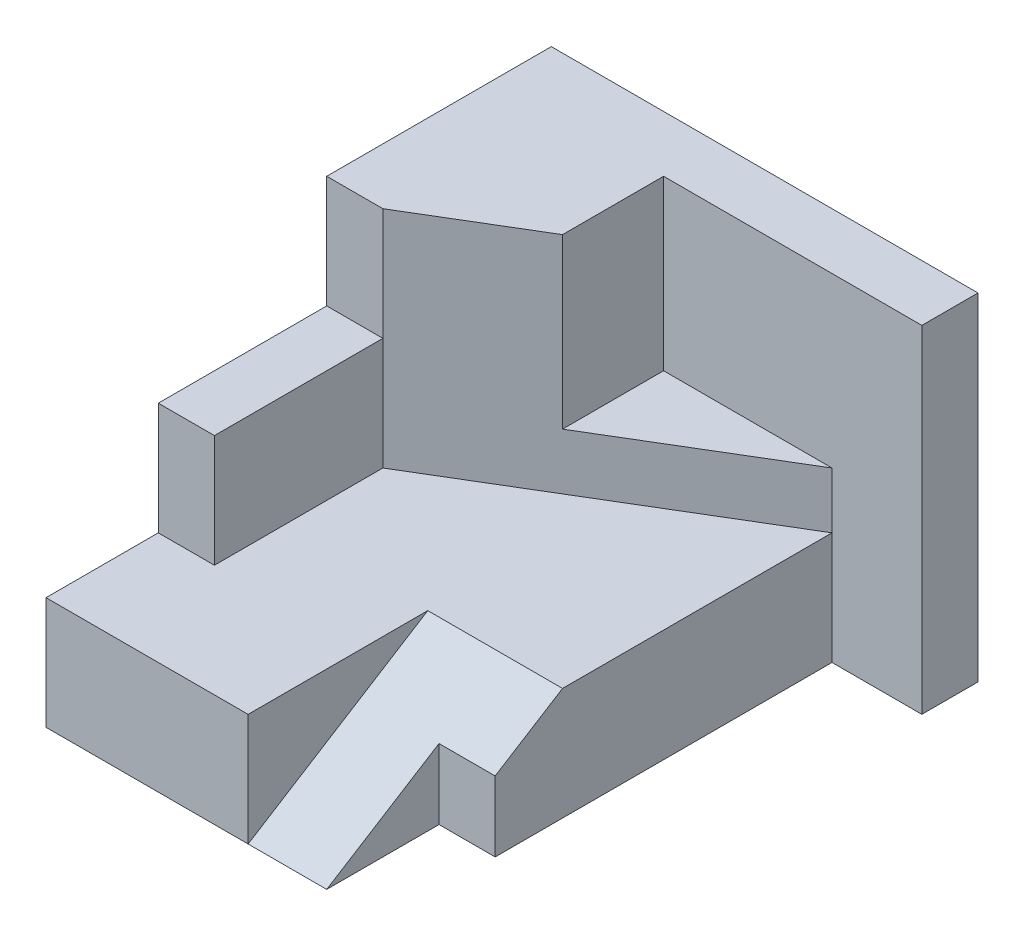
ISO-10303-21;
HEADER;
FILE_DESCRIPTION(('STEP AP214'),'2;1');
FILE_NAME('part.step','',(''),(''),'','','');
FILE_SCHEMA(('AUTOMOTIVE_DESIGN { 1 0 10303 214 1 1 1 1 }'));
ENDSEC;
DATA;
#1=APPLICATION_CONTEXT('core data for automotive mechanical design processes');
#2=APPLICATION_PROTOCOL_DEFINITION('international standard','automotive_design',2000,#1);
#3=PRODUCT_CONTEXT('',#1,'mechanical');
#4=PRODUCT('Part','Part','',(#3));
#5=PRODUCT_RELATED_PRODUCT_CATEGORY('part','',(#4));
#6=PRODUCT_DEFINITION_FORMATION('','',#4);
#7=PRODUCT_DEFINITION_CONTEXT('part definition',#1,'design');
#8=PRODUCT_DEFINITION('design','',#6,#7);
#9=PRODUCT_DEFINITION_SHAPE('','',#8);
#10=(LENGTH_UNIT() NAMED_UNIT(*) SI_UNIT(.MILLI.,.METRE.));
#11=(NAMED_UNIT(*) PLANE_ANGLE_UNIT() SI_UNIT($,.RADIAN.));
#12=(NAMED_UNIT(*) SI_UNIT($,.STERADIAN.) SOLID_ANGLE_UNIT());
#13=UNCERTAINTY_MEASURE_WITH_UNIT(LENGTH_MEASURE(1.E-05),#10,'distance_accuracy_value','');
#14=(GEOMETRIC_REPRESENTATION_CONTEXT(3) GLOBAL_UNCERTAINTY_ASSIGNED_CONTEXT((#13)) GLOBAL_UNIT_ASSIGNED_CONTEXT((#10,
#11,#12)) REPRESENTATION_CONTEXT('',''));
#15=CARTESIAN_POINT('',(0.,0.,0.));
#16=DIRECTION('',(0.,0.,1.));
#17=DIRECTION('',(1.,0.,0.));
#18=AXIS2_PLACEMENT_3D('',#15,#16,#17);
#19=CARTESIAN_POINT('',(0.,0.,0.));
#20=DIRECTION('',(0.,-1.,0.));
#21=DIRECTION('',(0.,0.,-1.));
#22=AXIS2_PLACEMENT_3D('',#19,#20,#21);
#23=PLANE('',#22);
#24=DIRECTION('',(0.,0.,-1.));
#25=VECTOR('',#24,1.);
#26=CARTESIAN_POINT('',(30.,0.,0.));
#27=LINE('',#26,#25);
#28=CARTESIAN_POINT('',(30.,0.,35.));
#29=VERTEX_POINT('',#28);
#30=CARTESIAN_POINT('',(30.,0.,5.));
#31=VERTEX_POINT('',#30);
#32=EDGE_CURVE('E170',#29,#31,#27,.T.);
#33=ORIENTED_EDGE('',*,*,#32,.F.);
#34=DIRECTION('',(-1.,0.,0.));
#35=VECTOR('',#34,1.);
#36=CARTESIAN_POINT('',(30.,0.,35.));
#37=LINE('',#36,#35);
#38=CARTESIAN_POINT('',(25.,0.,35.));
#39=VERTEX_POINT('',#38);
#40=EDGE_CURVE('E155',#29,#39,#37,.T.);
#41=ORIENTED_EDGE('',*,*,#40,.T.);
#42=DIRECTION('',(0.,0.,1.));
#43=VECTOR('',#42,1.);
#44=CARTESIAN_POINT('',(25.,0.,45.));
#45=LINE('',#44,#43);
#46=CARTESIAN_POINT('',(25.,0.,45.));
#47=VERTEX_POINT('',#46);
#48=EDGE_CURVE('E164',#39,#47,#45,.T.);
#49=ORIENTED_EDGE('',*,*,#48,.T.);
#50=DIRECTION('',(1.,0.,0.));
#51=VECTOR('',#50,1.);
#52=CARTESIAN_POINT('',(18.,0.,45.));
#53=LINE('',#52,#51);
#54=CARTESIAN_POINT('',(18.,0.,45.));
#55=VERTEX_POINT('',#54);
#56=EDGE_CURVE('E264',#55,#47,#53,.T.);
#57=ORIENTED_EDGE('',*,*,#56,.F.);
#58=DIRECTION('',(1.,0.,0.));
#59=VECTOR('',#58,1.);
#60=CARTESIAN_POINT('',(0.,0.,45.));
#61=LINE('',#60,#59);
#62=CARTESIAN_POINT('',(0.,0.,45.));
#63=VERTEX_POINT('',#62);
#64=EDGE_CURVE('E181',#63,#55,#61,.T.);
#65=ORIENTED_EDGE('',*,*,#64,.F.);
#66=DIRECTION('',(0.,0.,1.));
#67=VECTOR('',#66,1.);
#68=CARTESIAN_POINT('',(0.,0.,20.));
#69=LINE('',#68,#67);
#70=CARTESIAN_POINT('',(0.,0.,0.));
#71=VERTEX_POINT('',#70);
#72=EDGE_CURVE('E204',#71,#63,#69,.T.);
#73=ORIENTED_EDGE('',*,*,#72,.F.);
#74=DIRECTION('',(-1.,0.,0.));
#75=VECTOR('',#74,1.);
#76=CARTESIAN_POINT('',(0.,0.,0.));
#77=LINE('',#76,#75);
#78=CARTESIAN_POINT('',(38.,0.,0.));
#79=VERTEX_POINT('',#78);
#80=EDGE_CURVE('E210',#79,#71,#77,.T.);
#81=ORIENTED_EDGE('',*,*,#80,.F.);
#82=DIRECTION('',(0.,0.,-1.));
#83=VECTOR('',#82,1.);
#84=CARTESIAN_POINT('',(38.,0.,0.));
#85=LINE('',#84,#83);
#86=CARTESIAN_POINT('',(38.,0.,5.));
#87=VERTEX_POINT('',#86);
#88=EDGE_CURVE('E231',#87,#79,#85,.T.);
#89=ORIENTED_EDGE('',*,*,#88,.F.);
#90=DIRECTION('',(1.,0.,0.));
#91=VECTOR('',#90,1.);
#92=CARTESIAN_POINT('',(38.,0.,5.));
#93=LINE('',#92,#91);
#94=EDGE_CURVE('E178',#31,#87,#93,.T.);
#95=ORIENTED_EDGE('',*,*,#94,.F.);
#96=EDGE_LOOP('',(#33,#41,#49,#57,#65,#73,#81,#89,#95));
#97=FACE_BOUND('',#96,.T.);
#98=ADVANCED_FACE('F39',(#97),#23,.T.);
#99=CARTESIAN_POINT('',(30.,10.,0.));
#100=DIRECTION('',(-1.,0.,0.));
#101=DIRECTION('',(0.,0.,1.));
#102=AXIS2_PLACEMENT_3D('',#99,#100,#101);
#103=PLANE('',#102);
#104=DIRECTION('',(0.,-1.,0.));
#105=VECTOR('',#104,1.);
#106=CARTESIAN_POINT('',(30.,30.,35.));
#107=LINE('',#106,#105);
#108=CARTESIAN_POINT('',(30.,6.25,35.));
#109=VERTEX_POINT('',#108);
#110=EDGE_CURVE('E158',#109,#29,#107,.T.);
#111=ORIENTED_EDGE('',*,*,#110,.T.);
#112=ORIENTED_EDGE('',*,*,#32,.T.);
#113=DIRECTION('',(0.,1.,0.));
#114=VECTOR('',#113,1.);
#115=CARTESIAN_POINT('',(30.,30.,5.));
#116=LINE('',#115,#114);
#117=CARTESIAN_POINT('',(30.,10.,5.));
#118=VERTEX_POINT('',#117);
#119=EDGE_CURVE('E196',#31,#118,#116,.T.);
#120=ORIENTED_EDGE('',*,*,#119,.T.);
#121=DIRECTION('',(0.,0.,-1.));
#122=VECTOR('',#121,1.);
#123=CARTESIAN_POINT('',(30.,10.,0.));
#124=LINE('',#123,#122);
#125=CARTESIAN_POINT('',(30.,10.,29.));
#126=VERTEX_POINT('',#125);
#127=EDGE_CURVE('E197',#126,#118,#124,.T.);
#128=ORIENTED_EDGE('',*,*,#127,.F.);
#129=DIRECTION('',(0.,0.52999894000318,-0.847998304005088));
#130=VECTOR('',#129,1.);
#131=CARTESIAN_POINT('',(30.,0.,45.));
#132=LINE('',#131,#130);
#133=EDGE_CURVE('E173',#109,#126,#132,.T.);
#134=ORIENTED_EDGE('',*,*,#133,.F.);
#135=EDGE_LOOP('',(#111,#112,#120,#128,#134));
#136=FACE_BOUND('',#135,.T.);
#137=ADVANCED_FACE('F168',(#136),#103,.F.);
#138=CARTESIAN_POINT('',(18.,0.,45.));
#139=DIRECTION('',(0.,-0.847998304005088,-0.52999894000318));
#140=DIRECTION('',(0.,0.52999894000318,-0.847998304005088));
#141=AXIS2_PLACEMENT_3D('',#138,#139,#140);
#142=PLANE('',#141);
#143=DIRECTION('',(-1.,0.,0.));
#144=VECTOR('',#143,1.);
#145=CARTESIAN_POINT('',(18.,6.25,35.));
#146=LINE('',#145,#144);
#147=CARTESIAN_POINT('',(25.,6.25,35.));
#148=VERTEX_POINT('',#147);
#149=EDGE_CURVE('E11',#109,#148,#146,.T.);
#150=ORIENTED_EDGE('',*,*,#149,.F.);
#151=ORIENTED_EDGE('',*,*,#133,.T.);
#152=DIRECTION('',(1.,0.,0.));
#153=VECTOR('',#152,1.);
#154=CARTESIAN_POINT('',(18.,10.,29.));
#155=LINE('',#154,#153);
#156=CARTESIAN_POINT('',(18.,10.,29.));
#157=VERTEX_POINT('',#156);
#158=EDGE_CURVE('E271',#157,#126,#155,.T.);
#159=ORIENTED_EDGE('',*,*,#158,.F.);
#160=DIRECTION('',(0.,0.52999894000318,-0.847998304005088));
#161=VECTOR('',#160,1.);
#162=CARTESIAN_POINT('',(18.,0.,45.));
#163=LINE('',#162,#161);
#164=EDGE_CURVE('E269',#55,#157,#163,.T.);
#165=ORIENTED_EDGE('',*,*,#164,.F.);
#166=ORIENTED_EDGE('',*,*,#56,.T.);
#167=DIRECTION('',(0.,-0.52999894000318,0.847998304005088));
#168=VECTOR('',#167,1.);
#169=CARTESIAN_POINT('',(25.,0.,45.));
#170=LINE('',#169,#168);
#171=EDGE_CURVE('E48',#148,#47,#170,.T.);
#172=ORIENTED_EDGE('',*,*,#171,.F.);
#173=EDGE_LOOP('',(#150,#151,#159,#165,#166,#172));
#174=FACE_BOUND('',#173,.T.);
#175=ADVANCED_FACE('F268',(#174),#142,.F.);
#176=CARTESIAN_POINT('',(0.,10.,45.));
#177=DIRECTION('',(0.,0.,-1.));
#178=DIRECTION('',(-1.,0.,0.));
#179=AXIS2_PLACEMENT_3D('',#176,#177,#178);
#180=PLANE('',#179);
#181=DIRECTION('',(0.,-1.,0.));
#182=VECTOR('',#181,1.);
#183=CARTESIAN_POINT('',(18.,10.,45.));
#184=LINE('',#183,#182);
#185=CARTESIAN_POINT('',(18.,10.,45.));
#186=VERTEX_POINT('',#185);
#187=EDGE_CURVE('E278',#186,#55,#184,.T.);
#188=ORIENTED_EDGE('',*,*,#187,.F.);
#189=DIRECTION('',(1.,0.,0.));
#190=VECTOR('',#189,1.);
#191=CARTESIAN_POINT('',(0.,10.,45.));
#192=LINE('',#191,#190);
#193=CARTESIAN_POINT('',(0.,10.,45.));
#194=VERTEX_POINT('',#193);
#195=EDGE_CURVE('E185',#194,#186,#192,.T.);
#196=ORIENTED_EDGE('',*,*,#195,.F.);
#197=DIRECTION('',(0.,-1.,0.));
#198=VECTOR('',#197,1.);
#199=CARTESIAN_POINT('',(0.,10.,45.));
#200=LINE('',#199,#198);
#201=EDGE_CURVE('E192',#194,#63,#200,.T.);
#202=ORIENTED_EDGE('',*,*,#201,.T.);
#203=ORIENTED_EDGE('',*,*,#64,.T.);
#204=EDGE_LOOP('',(#188,#196,#202,#203));
#205=FACE_BOUND('',#204,.T.);
#206=ADVANCED_FACE('F367',(#205),#180,.F.);
#207=CARTESIAN_POINT('',(5.,30.,20.));
#208=DIRECTION('',(0.,0.,-1.));
#209=DIRECTION('',(-1.,0.,0.));
#210=AXIS2_PLACEMENT_3D('',#207,#208,#209);
#211=PLANE('',#210);
#212=DIRECTION('',(-1.,0.,0.));
#213=VECTOR('',#212,1.);
#214=CARTESIAN_POINT('',(5.,20.,20.));
#215=LINE('',#214,#213);
#216=CARTESIAN_POINT('',(5.,20.,20.));
#217=VERTEX_POINT('',#216);
#218=CARTESIAN_POINT('',(0.,20.,20.));
#219=VERTEX_POINT('',#218);
#220=EDGE_CURVE('E188',#217,#219,#215,.T.);
#221=ORIENTED_EDGE('',*,*,#220,.F.);
#222=DIRECTION('',(0.,-1.,0.));
#223=VECTOR('',#222,1.);
#224=CARTESIAN_POINT('',(5.,30.,20.));
#225=LINE('',#224,#223);
#226=CARTESIAN_POINT('',(5.,30.,20.));
#227=VERTEX_POINT('',#226);
#228=EDGE_CURVE('E251',#227,#217,#225,.T.);
#229=ORIENTED_EDGE('',*,*,#228,.F.);
#230=DIRECTION('',(1.,0.,0.));
#231=VECTOR('',#230,1.);
#232=CARTESIAN_POINT('',(5.,30.,20.));
#233=LINE('',#232,#231);
#234=CARTESIAN_POINT('',(0.,30.,20.));
#235=VERTEX_POINT('',#234);
#236=EDGE_CURVE('E209',#235,#227,#233,.T.);
#237=ORIENTED_EDGE('',*,*,#236,.F.);
#238=DIRECTION('',(0.,-1.,0.));
#239=VECTOR('',#238,1.);
#240=CARTESIAN_POINT('',(0.,30.,20.));
#241=LINE('',#240,#239);
#242=EDGE_CURVE('E255',#235,#219,#241,.T.);
#243=ORIENTED_EDGE('',*,*,#242,.T.);
#244=EDGE_LOOP('',(#221,#229,#237,#243));
#245=FACE_BOUND('',#244,.T.);
#246=ADVANCED_FACE('F409',(#245),#211,.F.);
#247=CARTESIAN_POINT('',(0.,10.,0.));
#248=DIRECTION('',(0.,1.,0.));
#249=DIRECTION('',(0.,0.,1.));
#250=AXIS2_PLACEMENT_3D('',#247,#248,#249);
#251=PLANE('',#250);
#252=ORIENTED_EDGE('',*,*,#158,.T.);
#253=ORIENTED_EDGE('',*,*,#127,.T.);
#254=DIRECTION('',(0.857492925712544,0.,-0.514495755427526));
#255=VECTOR('',#254,1.);
#256=CARTESIAN_POINT('',(30.,10.,5.));
#257=LINE('',#256,#255);
#258=CARTESIAN_POINT('',(5.,10.,20.));
#259=VERTEX_POINT('',#258);
#260=EDGE_CURVE('E200',#259,#118,#257,.T.);
#261=ORIENTED_EDGE('',*,*,#260,.F.);
#262=DIRECTION('',(0.,0.,-1.));
#263=VECTOR('',#262,1.);
#264=CARTESIAN_POINT('',(5.,10.,20.));
#265=LINE('',#264,#263);
#266=CARTESIAN_POINT('',(5.,10.,35.));
#267=VERTEX_POINT('',#266);
#268=EDGE_CURVE('E317',#267,#259,#265,.T.);
#269=ORIENTED_EDGE('',*,*,#268,.F.);
#270=DIRECTION('',(-1.,0.,0.));
#271=VECTOR('',#270,1.);
#272=CARTESIAN_POINT('',(5.,10.,35.));
#273=LINE('',#272,#271);
#274=CARTESIAN_POINT('',(0.,10.,35.));
#275=VERTEX_POINT('',#274);
#276=EDGE_CURVE('E321',#267,#275,#273,.T.);
#277=ORIENTED_EDGE('',*,*,#276,.T.);
#278=DIRECTION('',(0.,0.,1.));
#279=VECTOR('',#278,1.);
#280=CARTESIAN_POINT('',(0.,10.,0.));
#281=LINE('',#280,#279);
#282=EDGE_CURVE('E180',#275,#194,#281,.T.);
#283=ORIENTED_EDGE('',*,*,#282,.T.);
#284=ORIENTED_EDGE('',*,*,#195,.T.);
#285=DIRECTION('',(0.,0.,1.));
#286=VECTOR('',#285,1.);
#287=CARTESIAN_POINT('',(18.,10.,29.));
#288=LINE('',#287,#286);
#289=EDGE_CURVE('E62',#157,#186,#288,.T.);
#290=ORIENTED_EDGE('',*,*,#289,.F.);
#291=EDGE_LOOP('',(#252,#253,#261,#269,#277,#283,#284,#290));
#292=FACE_BOUND('',#291,.T.);
#293=ADVANCED_FACE('F342',(#292),#251,.T.);
#294=CARTESIAN_POINT('',(0.,30.,20.));
#295=DIRECTION('',(1.,0.,0.));
#296=DIRECTION('',(0.,0.,-1.));
#297=AXIS2_PLACEMENT_3D('',#294,#295,#296);
#298=PLANE('',#297);
#299=DIRECTION('',(0.,0.,1.));
#300=VECTOR('',#299,1.);
#301=CARTESIAN_POINT('',(0.,20.,20.));
#302=LINE('',#301,#300);
#303=CARTESIAN_POINT('',(0.,20.,35.));
#304=VERTEX_POINT('',#303);
#305=EDGE_CURVE('E301',#219,#304,#302,.T.);
#306=ORIENTED_EDGE('',*,*,#305,.F.);
#307=ORIENTED_EDGE('',*,*,#242,.F.);
#308=DIRECTION('',(0.,0.,1.));
#309=VECTOR('',#308,1.);
#310=CARTESIAN_POINT('',(0.,30.,20.));
#311=LINE('',#310,#309);
#312=CARTESIAN_POINT('',(0.,30.,0.));
#313=VERTEX_POINT('',#312);
#314=EDGE_CURVE('E205',#313,#235,#311,.T.);
#315=ORIENTED_EDGE('',*,*,#314,.F.);
#316=DIRECTION('',(0.,-1.,0.));
#317=VECTOR('',#316,1.);
#318=CARTESIAN_POINT('',(0.,30.,0.));
#319=LINE('',#318,#317);
#320=EDGE_CURVE('E226',#313,#71,#319,.T.);
#321=ORIENTED_EDGE('',*,*,#320,.T.);
#322=ORIENTED_EDGE('',*,*,#72,.T.);
#323=ORIENTED_EDGE('',*,*,#201,.F.);
#324=ORIENTED_EDGE('',*,*,#282,.F.);
#325=DIRECTION('',(0.,-1.,0.));
#326=VECTOR('',#325,1.);
#327=CARTESIAN_POINT('',(0.,10.,35.));
#328=LINE('',#327,#326);
#329=EDGE_CURVE('E310',#304,#275,#328,.T.);
#330=ORIENTED_EDGE('',*,*,#329,.F.);
#331=EDGE_LOOP('',(#306,#307,#315,#321,#322,#323,#324,#330));
#332=FACE_BOUND('',#331,.T.);
#333=ADVANCED_FACE('F41',(#332),#298,.F.);
#334=CARTESIAN_POINT('',(30.,30.,5.));
#335=DIRECTION('',(-0.514495755427526,0.,-0.857492925712544));
#336=DIRECTION('',(-0.857492925712544,0.,0.514495755427526));
#337=AXIS2_PLACEMENT_3D('',#334,#335,#336);
#338=PLANE('',#337);
#339=DIRECTION('',(0.857492925712544,0.,-0.514495755427527));
#340=VECTOR('',#339,1.);
#341=CARTESIAN_POINT('',(15.,15.,14.));
#342=LINE('',#341,#340);
#343=CARTESIAN_POINT('',(15.,15.,14.));
#344=VERTEX_POINT('',#343);
#345=CARTESIAN_POINT('',(30.,15.,5.));
#346=VERTEX_POINT('',#345);
#347=EDGE_CURVE('E282',#344,#346,#342,.T.);
#348=ORIENTED_EDGE('',*,*,#347,.F.);
#349=DIRECTION('',(0.,1.,0.));
#350=VECTOR('',#349,1.);
#351=CARTESIAN_POINT('',(15.,15.,14.));
#352=LINE('',#351,#350);
#353=CARTESIAN_POINT('',(15.,30.,14.));
#354=VERTEX_POINT('',#353);
#355=EDGE_CURVE('E297',#344,#354,#352,.T.);
#356=ORIENTED_EDGE('',*,*,#355,.T.);
#357=DIRECTION('',(0.857492925712544,0.,-0.514495755427526));
#358=VECTOR('',#357,1.);
#359=CARTESIAN_POINT('',(30.,30.,5.));
#360=LINE('',#359,#358);
#361=EDGE_CURVE('E213',#227,#354,#360,.T.);
#362=ORIENTED_EDGE('',*,*,#361,.F.);
#363=ORIENTED_EDGE('',*,*,#228,.T.);
#364=DIRECTION('',(0.,1.,0.));
#365=VECTOR('',#364,1.);
#366=CARTESIAN_POINT('',(5.,10.,20.));
#367=LINE('',#366,#365);
#368=EDGE_CURVE('E305',#259,#217,#367,.T.);
#369=ORIENTED_EDGE('',*,*,#368,.F.);
#370=ORIENTED_EDGE('',*,*,#260,.T.);
#371=DIRECTION('',(0.,-1.,0.));
#372=VECTOR('',#371,1.);
#373=CARTESIAN_POINT('',(30.,30.,5.));
#374=LINE('',#373,#372);
#375=EDGE_CURVE('E247',#346,#118,#374,.T.);
#376=ORIENTED_EDGE('',*,*,#375,.F.);
#377=EDGE_LOOP('',(#348,#356,#362,#363,#369,#370,#376));
#378=FACE_BOUND('',#377,.T.);
#379=ADVANCED_FACE('F348',(#378),#338,.F.);
#380=CARTESIAN_POINT('',(38.,30.,5.));
#381=DIRECTION('',(0.,0.,-1.));
#382=DIRECTION('',(-1.,0.,0.));
#383=AXIS2_PLACEMENT_3D('',#380,#381,#382);
#384=PLANE('',#383);
#385=ORIENTED_EDGE('',*,*,#94,.T.);
#386=DIRECTION('',(0.,-1.,0.));
#387=VECTOR('',#386,1.);
#388=CARTESIAN_POINT('',(38.,30.,5.));
#389=LINE('',#388,#387);
#390=CARTESIAN_POINT('',(38.,30.,5.));
#391=VERTEX_POINT('',#390);
#392=EDGE_CURVE('E243',#391,#87,#389,.T.);
#393=ORIENTED_EDGE('',*,*,#392,.F.);
#394=DIRECTION('',(1.,0.,0.));
#395=VECTOR('',#394,1.);
#396=CARTESIAN_POINT('',(38.,30.,5.));
#397=LINE('',#396,#395);
#398=CARTESIAN_POINT('',(15.,30.,5.));
#399=VERTEX_POINT('',#398);
#400=EDGE_CURVE('E217',#399,#391,#397,.T.);
#401=ORIENTED_EDGE('',*,*,#400,.F.);
#402=DIRECTION('',(0.,1.,0.));
#403=VECTOR('',#402,1.);
#404=CARTESIAN_POINT('',(15.,15.,5.));
#405=LINE('',#404,#403);
#406=CARTESIAN_POINT('',(15.,15.,5.));
#407=VERTEX_POINT('',#406);
#408=EDGE_CURVE('E294',#407,#399,#405,.T.);
#409=ORIENTED_EDGE('',*,*,#408,.F.);
#410=DIRECTION('',(-1.,0.,0.));
#411=VECTOR('',#410,1.);
#412=CARTESIAN_POINT('',(30.,15.,5.));
#413=LINE('',#412,#411);
#414=EDGE_CURVE('E286',#346,#407,#413,.T.);
#415=ORIENTED_EDGE('',*,*,#414,.F.);
#416=ORIENTED_EDGE('',*,*,#375,.T.);
#417=ORIENTED_EDGE('',*,*,#119,.F.);
#418=EDGE_LOOP('',(#385,#393,#401,#409,#415,#416,#417));
#419=FACE_BOUND('',#418,.T.);
#420=ADVANCED_FACE('F345',(#419),#384,.F.);
#421=CARTESIAN_POINT('',(38.,30.,0.));
#422=DIRECTION('',(-1.,0.,0.));
#423=DIRECTION('',(0.,0.,1.));
#424=AXIS2_PLACEMENT_3D('',#421,#422,#423);
#425=PLANE('',#424);
#426=ORIENTED_EDGE('',*,*,#88,.T.);
#427=DIRECTION('',(0.,-1.,0.));
#428=VECTOR('',#427,1.);
#429=CARTESIAN_POINT('',(38.,30.,0.));
#430=LINE('',#429,#428);
#431=CARTESIAN_POINT('',(38.,30.,0.));
#432=VERTEX_POINT('',#431);
#433=EDGE_CURVE('E239',#432,#79,#430,.T.);
#434=ORIENTED_EDGE('',*,*,#433,.F.);
#435=DIRECTION('',(0.,0.,-1.));
#436=VECTOR('',#435,1.);
#437=CARTESIAN_POINT('',(38.,30.,0.));
#438=LINE('',#437,#436);
#439=EDGE_CURVE('E220',#391,#432,#438,.T.);
#440=ORIENTED_EDGE('',*,*,#439,.F.);
#441=ORIENTED_EDGE('',*,*,#392,.T.);
#442=EDGE_LOOP('',(#426,#434,#440,#441));
#443=FACE_BOUND('',#442,.T.);
#444=ADVANCED_FACE('F401',(#443),#425,.F.);
#445=CARTESIAN_POINT('',(0.,30.,0.));
#446=DIRECTION('',(0.,0.,1.));
#447=DIRECTION('',(1.,0.,0.));
#448=AXIS2_PLACEMENT_3D('',#445,#446,#447);
#449=PLANE('',#448);
#450=ORIENTED_EDGE('',*,*,#80,.T.);
#451=ORIENTED_EDGE('',*,*,#320,.F.);
#452=DIRECTION('',(-1.,0.,0.));
#453=VECTOR('',#452,1.);
#454=CARTESIAN_POINT('',(0.,30.,0.));
#455=LINE('',#454,#453);
#456=EDGE_CURVE('E223',#432,#313,#455,.T.);
#457=ORIENTED_EDGE('',*,*,#456,.F.);
#458=ORIENTED_EDGE('',*,*,#433,.T.);
#459=EDGE_LOOP('',(#450,#451,#457,#458));
#460=FACE_BOUND('',#459,.T.);
#461=ADVANCED_FACE('F398',(#460),#449,.F.);
#462=CARTESIAN_POINT('',(0.,30.,0.));
#463=DIRECTION('',(0.,-1.,0.));
#464=DIRECTION('',(0.,0.,-1.));
#465=AXIS2_PLACEMENT_3D('',#462,#463,#464);
#466=PLANE('',#465);
#467=ORIENTED_EDGE('',*,*,#361,.T.);
#468=DIRECTION('',(0.,0.,1.));
#469=VECTOR('',#468,1.);
#470=CARTESIAN_POINT('',(15.,30.,5.));
#471=LINE('',#470,#469);
#472=EDGE_CURVE('E276',#399,#354,#471,.T.);
#473=ORIENTED_EDGE('',*,*,#472,.F.);
#474=ORIENTED_EDGE('',*,*,#400,.T.);
#475=ORIENTED_EDGE('',*,*,#439,.T.);
#476=ORIENTED_EDGE('',*,*,#456,.T.);
#477=ORIENTED_EDGE('',*,*,#314,.T.);
#478=ORIENTED_EDGE('',*,*,#236,.T.);
#479=EDGE_LOOP('',(#467,#473,#474,#475,#476,#477,#478));
#480=FACE_BOUND('',#479,.T.);
#481=ADVANCED_FACE('F396',(#480),#466,.F.);
#482=CARTESIAN_POINT('',(5.,20.,20.));
#483=DIRECTION('',(0.,-1.,0.));
#484=DIRECTION('',(0.,0.,-1.));
#485=AXIS2_PLACEMENT_3D('',#482,#483,#484);
#486=PLANE('',#485);
#487=ORIENTED_EDGE('',*,*,#305,.T.);
#488=DIRECTION('',(-1.,0.,0.));
#489=VECTOR('',#488,1.);
#490=CARTESIAN_POINT('',(5.,20.,35.));
#491=LINE('',#490,#489);
#492=CARTESIAN_POINT('',(5.,20.,35.));
#493=VERTEX_POINT('',#492);
#494=EDGE_CURVE('E330',#493,#304,#491,.T.);
#495=ORIENTED_EDGE('',*,*,#494,.F.);
#496=DIRECTION('',(0.,0.,1.));
#497=VECTOR('',#496,1.);
#498=CARTESIAN_POINT('',(5.,20.,20.));
#499=LINE('',#498,#497);
#500=EDGE_CURVE('E309',#217,#493,#499,.T.);
#501=ORIENTED_EDGE('',*,*,#500,.F.);
#502=ORIENTED_EDGE('',*,*,#220,.T.);
#503=EDGE_LOOP('',(#487,#495,#501,#502));
#504=FACE_BOUND('',#503,.T.);
#505=ADVANCED_FACE('F418',(#504),#486,.F.);
#506=CARTESIAN_POINT('',(5.,10.,35.));
#507=DIRECTION('',(0.,0.,-1.));
#508=DIRECTION('',(-1.,0.,0.));
#509=AXIS2_PLACEMENT_3D('',#506,#507,#508);
#510=PLANE('',#509);
#511=ORIENTED_EDGE('',*,*,#329,.T.);
#512=ORIENTED_EDGE('',*,*,#276,.F.);
#513=DIRECTION('',(0.,-1.,0.));
#514=VECTOR('',#513,1.);
#515=CARTESIAN_POINT('',(5.,10.,35.));
#516=LINE('',#515,#514);
#517=EDGE_CURVE('E313',#493,#267,#516,.T.);
#518=ORIENTED_EDGE('',*,*,#517,.F.);
#519=ORIENTED_EDGE('',*,*,#494,.T.);
#520=EDGE_LOOP('',(#511,#512,#518,#519));
#521=FACE_BOUND('',#520,.T.);
#522=ADVANCED_FACE('F360',(#521),#510,.F.);
#523=CARTESIAN_POINT('',(5.,0.,0.));
#524=DIRECTION('',(1.,0.,0.));
#525=DIRECTION('',(0.,0.,-1.));
#526=AXIS2_PLACEMENT_3D('',#523,#524,#525);
#527=PLANE('',#526);
#528=ORIENTED_EDGE('',*,*,#368,.T.);
#529=ORIENTED_EDGE('',*,*,#500,.T.);
#530=ORIENTED_EDGE('',*,*,#517,.T.);
#531=ORIENTED_EDGE('',*,*,#268,.T.);
#532=EDGE_LOOP('',(#528,#529,#530,#531));
#533=FACE_BOUND('',#532,.T.);
#534=ADVANCED_FACE('F353',(#533),#527,.T.);
#535=CARTESIAN_POINT('',(15.,15.,5.));
#536=DIRECTION('',(-1.,0.,0.));
#537=DIRECTION('',(0.,0.,1.));
#538=AXIS2_PLACEMENT_3D('',#535,#536,#537);
#539=PLANE('',#538);
#540=ORIENTED_EDGE('',*,*,#472,.T.);
#541=ORIENTED_EDGE('',*,*,#355,.F.);
#542=DIRECTION('',(0.,0.,1.));
#543=VECTOR('',#542,1.);
#544=CARTESIAN_POINT('',(15.,15.,5.));
#545=LINE('',#544,#543);
#546=EDGE_CURVE('E290',#407,#344,#545,.T.);
#547=ORIENTED_EDGE('',*,*,#546,.F.);
#548=ORIENTED_EDGE('',*,*,#408,.T.);
#549=EDGE_LOOP('',(#540,#541,#547,#548));
#550=FACE_BOUND('',#549,.T.);
#551=ADVANCED_FACE('F384',(#550),#539,.F.);
#552=CARTESIAN_POINT('',(0.,15.,0.));
#553=DIRECTION('',(0.,-1.,0.));
#554=DIRECTION('',(0.,0.,-1.));
#555=AXIS2_PLACEMENT_3D('',#552,#553,#554);
#556=PLANE('',#555);
#557=ORIENTED_EDGE('',*,*,#347,.T.);
#558=ORIENTED_EDGE('',*,*,#414,.T.);
#559=ORIENTED_EDGE('',*,*,#546,.T.);
#560=EDGE_LOOP('',(#557,#558,#559));
#561=FACE_BOUND('',#560,.T.);
#562=ADVANCED_FACE('F377',(#561),#556,.F.);
#563=CARTESIAN_POINT('',(18.,0.,0.));
#564=DIRECTION('',(1.,0.,0.));
#565=DIRECTION('',(0.,0.,-1.));
#566=AXIS2_PLACEMENT_3D('',#563,#564,#565);
#567=PLANE('',#566);
#568=ORIENTED_EDGE('',*,*,#289,.T.);
#569=ORIENTED_EDGE('',*,*,#187,.T.);
#570=ORIENTED_EDGE('',*,*,#164,.T.);
#571=EDGE_LOOP('',(#568,#569,#570));
#572=FACE_BOUND('',#571,.T.);
#573=ADVANCED_FACE('F375',(#572),#567,.T.);
#574=CARTESIAN_POINT('',(30.,30.,35.));
#575=DIRECTION('',(0.,0.,1.));
#576=DIRECTION('',(1.,0.,0.));
#577=AXIS2_PLACEMENT_3D('',#574,#575,#576);
#578=PLANE('',#577);
#579=ORIENTED_EDGE('',*,*,#149,.T.);
#580=DIRECTION('',(0.,-1.,0.));
#581=VECTOR('',#580,1.);
#582=CARTESIAN_POINT('',(25.,30.,35.));
#583=LINE('',#582,#581);
#584=EDGE_CURVE('E55',#148,#39,#583,.T.);
#585=ORIENTED_EDGE('',*,*,#584,.T.);
#586=ORIENTED_EDGE('',*,*,#40,.F.);
#587=ORIENTED_EDGE('',*,*,#110,.F.);
#588=EDGE_LOOP('',(#579,#585,#586,#587));
#589=FACE_BOUND('',#588,.T.);
#590=ADVANCED_FACE('F157',(#589),#578,.T.);
#591=CARTESIAN_POINT('',(25.,30.,45.));
#592=DIRECTION('',(1.,0.,0.));
#593=DIRECTION('',(0.,0.,-1.));
#594=AXIS2_PLACEMENT_3D('',#591,#592,#593);
#595=PLANE('',#594);
#596=ORIENTED_EDGE('',*,*,#171,.T.);
#597=ORIENTED_EDGE('',*,*,#48,.F.);
#598=ORIENTED_EDGE('',*,*,#584,.F.);
#599=EDGE_LOOP('',(#596,#597,#598));
#600=FACE_BOUND('',#599,.T.);
#601=ADVANCED_FACE('F259',(#600),#595,.T.);
#602=CLOSED_SHELL('',(#98,#137,#175,#206,#246,#293,#333,#379,#420,#444,#461,#481,#505,#522,#534,
#551,#562,#573,#590,#601));
#603=MANIFOLD_SOLID_BREP('B2',#602);
#604=ADVANCED_BREP_SHAPE_REPRESENTATION('',(#18,#603),#14);
#605=SHAPE_DEFINITION_REPRESENTATION(#9,#604);
ENDSEC;
END-ISO-10303-21;
